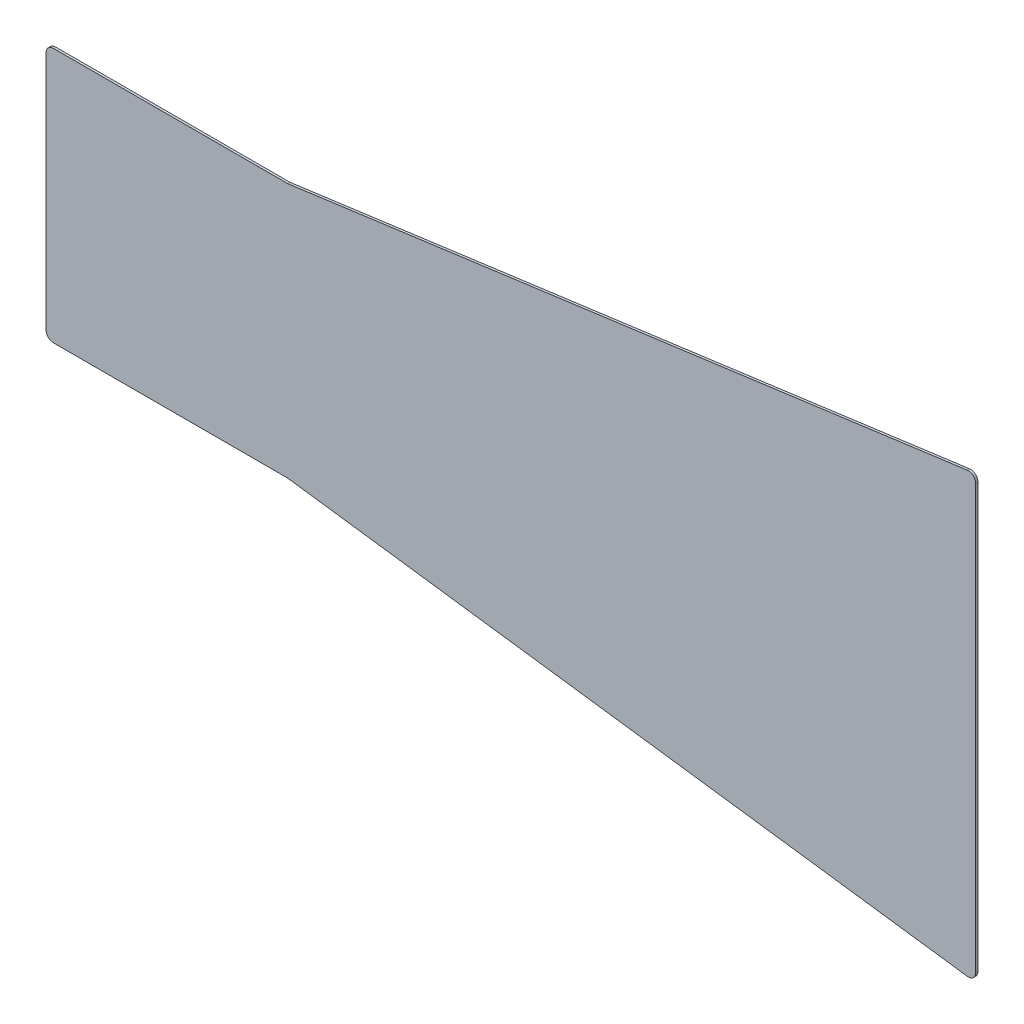
ISO-10303-21;
HEADER;
FILE_DESCRIPTION(('STEP AP214'),'2;1');
FILE_NAME('part.step','',(''),(''),'','','');
FILE_SCHEMA(('AUTOMOTIVE_DESIGN { 1 0 10303 214 1 1 1 1 }'));
ENDSEC;
DATA;
#1=APPLICATION_CONTEXT('core data for automotive mechanical design processes');
#2=APPLICATION_PROTOCOL_DEFINITION('international standard','automotive_design',2000,#1);
#3=PRODUCT_CONTEXT('',#1,'mechanical');
#4=PRODUCT('Part','Part','',(#3));
#5=PRODUCT_RELATED_PRODUCT_CATEGORY('part','',(#4));
#6=PRODUCT_DEFINITION_FORMATION('','',#4);
#7=PRODUCT_DEFINITION_CONTEXT('part definition',#1,'design');
#8=PRODUCT_DEFINITION('design','',#6,#7);
#9=PRODUCT_DEFINITION_SHAPE('','',#8);
#10=(LENGTH_UNIT() NAMED_UNIT(*) SI_UNIT(.MILLI.,.METRE.));
#11=(NAMED_UNIT(*) PLANE_ANGLE_UNIT() SI_UNIT($,.RADIAN.));
#12=(NAMED_UNIT(*) SI_UNIT($,.STERADIAN.) SOLID_ANGLE_UNIT());
#13=UNCERTAINTY_MEASURE_WITH_UNIT(LENGTH_MEASURE(1.E-05),#10,'distance_accuracy_value','');
#14=(GEOMETRIC_REPRESENTATION_CONTEXT(3) GLOBAL_UNCERTAINTY_ASSIGNED_CONTEXT((#13)) GLOBAL_UNIT_ASSIGNED_CONTEXT((#10,
#11,#12)) REPRESENTATION_CONTEXT('',''));
#15=CARTESIAN_POINT('',(0.,0.,0.));
#16=DIRECTION('',(0.,0.,1.));
#17=DIRECTION('',(1.,0.,0.));
#18=AXIS2_PLACEMENT_3D('',#15,#16,#17);
#19=CARTESIAN_POINT('',(-1276.36170533081,175.109237439629,-3.175));
#20=DIRECTION('',(0.,1.,0.));
#21=DIRECTION('',(0.,0.,1.));
#22=AXIS2_PLACEMENT_3D('',#19,#20,#21);
#23=PLANE('',#22);
#24=DIRECTION('',(-1.,0.,0.));
#25=VECTOR('',#24,1.);
#26=CARTESIAN_POINT('',(-1276.36170533081,175.109237439629,-3.175));
#27=LINE('',#26,#25);
#28=CARTESIAN_POINT('',(-944.783937854782,175.109237439629,-3.175));
#29=VERTEX_POINT('',#28);
#30=CARTESIAN_POINT('',(-1266.36170533081,175.109237439629,-3.175));
#31=VERTEX_POINT('',#30);
#32=EDGE_CURVE('E135',#29,#31,#27,.T.);
#33=ORIENTED_EDGE('',*,*,#32,.T.);
#34=DIRECTION('',(0.,0.,1.));
#35=VECTOR('',#34,1.);
#36=CARTESIAN_POINT('',(-1266.36170533081,175.109237439629,-3.175));
#37=LINE('',#36,#35);
#38=CARTESIAN_POINT('',(-1266.36170533081,175.109237439629,0.));
#39=VERTEX_POINT('',#38);
#40=EDGE_CURVE('E204',#31,#39,#37,.T.);
#41=ORIENTED_EDGE('',*,*,#40,.T.);
#42=DIRECTION('',(-1.,0.,0.));
#43=VECTOR('',#42,1.);
#44=CARTESIAN_POINT('',(-1276.36170533081,175.109237439629,0.));
#45=LINE('',#44,#43);
#46=CARTESIAN_POINT('',(-944.783937854782,175.109237439629,0.));
#47=VERTEX_POINT('',#46);
#48=EDGE_CURVE('E138',#47,#39,#45,.T.);
#49=ORIENTED_EDGE('',*,*,#48,.F.);
#50=DIRECTION('',(0.,0.,1.));
#51=VECTOR('',#50,1.);
#52=CARTESIAN_POINT('',(-944.783937854782,175.109237439629,-3.175));
#53=LINE('',#52,#51);
#54=EDGE_CURVE('E124',#29,#47,#53,.T.);
#55=ORIENTED_EDGE('',*,*,#54,.F.);
#56=EDGE_LOOP('',(#33,#41,#49,#55));
#57=FACE_BOUND('',#56,.T.);
#58=ADVANCED_FACE('F36',(#57),#23,.T.);
#59=CARTESIAN_POINT('',(-944.783937854782,175.109237439629,-3.175));
#60=DIRECTION('',(-0.133656993769155,0.991027652498452,0.));
#61=DIRECTION('',(-0.991027652498452,-0.133656993769155,0.));
#62=AXIS2_PLACEMENT_3D('',#59,#60,#61);
#63=PLANE('',#62);
#64=DIRECTION('',(-0.991027652498452,-0.133656993769155,0.));
#65=VECTOR('',#64,1.);
#66=CARTESIAN_POINT('',(-944.783937854782,175.109237439629,0.));
#67=LINE('',#66,#65);
#68=CARTESIAN_POINT('',(-11.3365699376916,301.000547054447,0.));
#69=VERTEX_POINT('',#68);
#70=EDGE_CURVE('E145',#69,#47,#67,.T.);
#71=ORIENTED_EDGE('',*,*,#70,.F.);
#72=DIRECTION('',(0.,0.,1.));
#73=VECTOR('',#72,1.);
#74=CARTESIAN_POINT('',(-11.3365699376915,301.000547054447,-3.175));
#75=LINE('',#74,#73);
#76=CARTESIAN_POINT('',(-11.3365699376916,301.000547054447,-3.175));
#77=VERTEX_POINT('',#76);
#78=EDGE_CURVE('E127',#69,#77,#75,.F.);
#79=ORIENTED_EDGE('',*,*,#78,.T.);
#80=DIRECTION('',(-0.991027652498452,-0.133656993769155,0.));
#81=VECTOR('',#80,1.);
#82=CARTESIAN_POINT('',(-944.783937854782,175.109237439629,-3.175));
#83=LINE('',#82,#81);
#84=EDGE_CURVE('E120',#77,#29,#83,.T.);
#85=ORIENTED_EDGE('',*,*,#84,.T.);
#86=ORIENTED_EDGE('',*,*,#54,.T.);
#87=EDGE_LOOP('',(#71,#79,#85,#86));
#88=FACE_BOUND('',#87,.T.);
#89=ADVANCED_FACE('F123',(#88),#63,.T.);
#90=CARTESIAN_POINT('',(0.,302.529477002774,-3.175));
#91=DIRECTION('',(1.,0.,0.));
#92=DIRECTION('',(0.,0.,-1.));
#93=AXIS2_PLACEMENT_3D('',#90,#91,#92);
#94=PLANE('',#93);
#95=DIRECTION('',(0.,1.,0.));
#96=VECTOR('',#95,1.);
#97=CARTESIAN_POINT('',(0.,302.529477002774,-3.175));
#98=LINE('',#97,#96);
#99=CARTESIAN_POINT('',(0.,-291.090270529462,-3.175));
#100=VERTEX_POINT('',#99);
#101=CARTESIAN_POINT('',(0.,291.090270529462,-3.175));
#102=VERTEX_POINT('',#101);
#103=EDGE_CURVE('E130',#100,#102,#98,.T.);
#104=ORIENTED_EDGE('',*,*,#103,.T.);
#105=DIRECTION('',(0.,0.,1.));
#106=VECTOR('',#105,1.);
#107=CARTESIAN_POINT('',(0.,291.090270529462,-3.175));
#108=LINE('',#107,#106);
#109=CARTESIAN_POINT('',(0.,291.090270529462,0.));
#110=VERTEX_POINT('',#109);
#111=EDGE_CURVE('E172',#102,#110,#108,.T.);
#112=ORIENTED_EDGE('',*,*,#111,.T.);
#113=DIRECTION('',(0.,1.,0.));
#114=VECTOR('',#113,1.);
#115=CARTESIAN_POINT('',(0.,302.529477002774,0.));
#116=LINE('',#115,#114);
#117=CARTESIAN_POINT('',(0.,-291.090270529462,0.));
#118=VERTEX_POINT('',#117);
#119=EDGE_CURVE('E149',#118,#110,#116,.T.);
#120=ORIENTED_EDGE('',*,*,#119,.F.);
#121=DIRECTION('',(0.,0.,1.));
#122=VECTOR('',#121,1.);
#123=CARTESIAN_POINT('',(0.,-291.090270529462,-3.175));
#124=LINE('',#123,#122);
#125=EDGE_CURVE('E139',#118,#100,#124,.F.);
#126=ORIENTED_EDGE('',*,*,#125,.T.);
#127=EDGE_LOOP('',(#104,#112,#120,#126));
#128=FACE_BOUND('',#127,.T.);
#129=ADVANCED_FACE('F235',(#128),#94,.T.);
#130=CARTESIAN_POINT('',(-944.783937854782,-175.109237439629,-3.175));
#131=DIRECTION('',(-0.133656993769155,-0.991027652498452,0.));
#132=DIRECTION('',(0.991027652498452,-0.133656993769155,0.));
#133=AXIS2_PLACEMENT_3D('',#130,#131,#132);
#134=PLANE('',#133);
#135=DIRECTION('',(0.991027652498452,-0.133656993769155,0.));
#136=VECTOR('',#135,1.);
#137=CARTESIAN_POINT('',(-944.783937854782,-175.109237439629,-3.175));
#138=LINE('',#137,#136);
#139=CARTESIAN_POINT('',(-944.118664438771,-175.198960914644,-3.175));
#140=VERTEX_POINT('',#139);
#141=CARTESIAN_POINT('',(-11.3365699376917,-301.000547054447,-3.175));
#142=VERTEX_POINT('',#141);
#143=EDGE_CURVE('E154',#140,#142,#138,.T.);
#144=ORIENTED_EDGE('',*,*,#143,.T.);
#145=DIRECTION('',(0.,0.,1.));
#146=VECTOR('',#145,1.);
#147=CARTESIAN_POINT('',(-11.3365699376916,-301.000547054447,-3.175));
#148=LINE('',#147,#146);
#149=CARTESIAN_POINT('',(-11.3365699376917,-301.000547054447,0.));
#150=VERTEX_POINT('',#149);
#151=EDGE_CURVE('E192',#142,#150,#148,.T.);
#152=ORIENTED_EDGE('',*,*,#151,.T.);
#153=DIRECTION('',(0.991027652498452,-0.133656993769155,0.));
#154=VECTOR('',#153,1.);
#155=CARTESIAN_POINT('',(-944.783937854782,-175.109237439629,0.));
#156=LINE('',#155,#154);
#157=CARTESIAN_POINT('',(-944.118664438771,-175.198960914644,0.));
#158=VERTEX_POINT('',#157);
#159=EDGE_CURVE('E166',#158,#150,#156,.T.);
#160=ORIENTED_EDGE('',*,*,#159,.F.);
#161=DIRECTION('',(0.,0.,1.));
#162=VECTOR('',#161,1.);
#163=CARTESIAN_POINT('',(-944.118664438771,-175.198960914644,-3.175));
#164=LINE('',#163,#162);
#165=EDGE_CURVE('E190',#158,#140,#164,.F.);
#166=ORIENTED_EDGE('',*,*,#165,.T.);
#167=EDGE_LOOP('',(#144,#152,#160,#166));
#168=FACE_BOUND('',#167,.T.);
#169=ADVANCED_FACE('F213',(#168),#134,.T.);
#170=CARTESIAN_POINT('',(-1276.36170533081,-175.109237439629,-3.175));
#171=DIRECTION('',(0.,-1.,0.));
#172=DIRECTION('',(1.,0.,0.));
#173=AXIS2_PLACEMENT_3D('',#170,#171,#172);
#174=PLANE('',#173);
#175=DIRECTION('',(1.,0.,0.));
#176=VECTOR('',#175,1.);
#177=CARTESIAN_POINT('',(-1276.36170533081,-175.109237439629,-3.175));
#178=LINE('',#177,#176);
#179=CARTESIAN_POINT('',(-1266.36170533081,-175.109237439629,-3.175));
#180=VERTEX_POINT('',#179);
#181=CARTESIAN_POINT('',(-945.455234376463,-175.109237439629,-3.175));
#182=VERTEX_POINT('',#181);
#183=EDGE_CURVE('E147',#180,#182,#178,.T.);
#184=ORIENTED_EDGE('',*,*,#183,.T.);
#185=DIRECTION('',(0.,0.,1.));
#186=VECTOR('',#185,1.);
#187=CARTESIAN_POINT('',(-945.455234376463,-175.109237439629,0.));
#188=LINE('',#187,#186);
#189=CARTESIAN_POINT('',(-945.455234376463,-175.109237439629,0.));
#190=VERTEX_POINT('',#189);
#191=EDGE_CURVE('E197',#182,#190,#188,.T.);
#192=ORIENTED_EDGE('',*,*,#191,.T.);
#193=DIRECTION('',(1.,0.,0.));
#194=VECTOR('',#193,1.);
#195=CARTESIAN_POINT('',(-1276.36170533081,-175.109237439629,0.));
#196=LINE('',#195,#194);
#197=CARTESIAN_POINT('',(-1266.36170533081,-175.109237439629,0.));
#198=VERTEX_POINT('',#197);
#199=EDGE_CURVE('E163',#198,#190,#196,.T.);
#200=ORIENTED_EDGE('',*,*,#199,.F.);
#201=DIRECTION('',(0.,0.,1.));
#202=VECTOR('',#201,1.);
#203=CARTESIAN_POINT('',(-1266.36170533081,-175.109237439629,-3.175));
#204=LINE('',#203,#202);
#205=EDGE_CURVE('E195',#198,#180,#204,.F.);
#206=ORIENTED_EDGE('',*,*,#205,.T.);
#207=EDGE_LOOP('',(#184,#192,#200,#206));
#208=FACE_BOUND('',#207,.T.);
#209=ADVANCED_FACE('F219',(#208),#174,.T.);
#210=CARTESIAN_POINT('',(-1276.36170533081,-175.109237439629,-3.175));
#211=DIRECTION('',(-1.,0.,0.));
#212=DIRECTION('',(0.,0.,1.));
#213=AXIS2_PLACEMENT_3D('',#210,#211,#212);
#214=PLANE('',#213);
#215=DIRECTION('',(0.,-1.,0.));
#216=VECTOR('',#215,1.);
#217=CARTESIAN_POINT('',(-1276.36170533081,-175.109237439629,-3.175));
#218=LINE('',#217,#216);
#219=CARTESIAN_POINT('',(-1276.36170533081,165.109237439629,-3.175));
#220=VERTEX_POINT('',#219);
#221=CARTESIAN_POINT('',(-1276.36170533081,-165.109237439629,-3.175));
#222=VERTEX_POINT('',#221);
#223=EDGE_CURVE('E144',#220,#222,#218,.T.);
#224=ORIENTED_EDGE('',*,*,#223,.T.);
#225=DIRECTION('',(0.,0.,1.));
#226=VECTOR('',#225,1.);
#227=CARTESIAN_POINT('',(-1276.36170533081,-165.109237439629,-3.175));
#228=LINE('',#227,#226);
#229=CARTESIAN_POINT('',(-1276.36170533081,-165.109237439629,0.));
#230=VERTEX_POINT('',#229);
#231=EDGE_CURVE('E201',#222,#230,#228,.T.);
#232=ORIENTED_EDGE('',*,*,#231,.T.);
#233=DIRECTION('',(0.,-1.,0.));
#234=VECTOR('',#233,1.);
#235=CARTESIAN_POINT('',(-1276.36170533081,-175.109237439629,0.));
#236=LINE('',#235,#234);
#237=CARTESIAN_POINT('',(-1276.36170533081,165.109237439629,0.));
#238=VERTEX_POINT('',#237);
#239=EDGE_CURVE('E160',#238,#230,#236,.T.);
#240=ORIENTED_EDGE('',*,*,#239,.F.);
#241=DIRECTION('',(0.,0.,1.));
#242=VECTOR('',#241,1.);
#243=CARTESIAN_POINT('',(-1276.36170533081,165.109237439629,-3.175));
#244=LINE('',#243,#242);
#245=EDGE_CURVE('E58',#238,#220,#244,.F.);
#246=ORIENTED_EDGE('',*,*,#245,.T.);
#247=EDGE_LOOP('',(#224,#232,#240,#246));
#248=FACE_BOUND('',#247,.T.);
#249=ADVANCED_FACE('F224',(#248),#214,.T.);
#250=CARTESIAN_POINT('',(0.,0.,-3.175));
#251=DIRECTION('',(0.,0.,-1.));
#252=DIRECTION('',(-1.,0.,0.));
#253=AXIS2_PLACEMENT_3D('',#250,#251,#252);
#254=PLANE('',#253);
#255=ORIENTED_EDGE('',*,*,#84,.F.);
#256=CARTESIAN_POINT('',(-10.,291.090270529462,-3.175));
#257=DIRECTION('',(0.,0.,-1.));
#258=DIRECTION('',(-1.,0.,0.));
#259=AXIS2_PLACEMENT_3D('',#256,#257,#258);
#260=CIRCLE('',#259,10.);
#261=EDGE_CURVE('E188',#77,#102,#260,.T.);
#262=ORIENTED_EDGE('',*,*,#261,.T.);
#263=ORIENTED_EDGE('',*,*,#103,.F.);
#264=CARTESIAN_POINT('',(-10.,-291.090270529462,-3.175));
#265=DIRECTION('',(0.,0.,-1.));
#266=DIRECTION('',(-1.,0.,0.));
#267=AXIS2_PLACEMENT_3D('',#264,#265,#266);
#268=CIRCLE('',#267,10.);
#269=EDGE_CURVE('E186',#100,#142,#268,.T.);
#270=ORIENTED_EDGE('',*,*,#269,.T.);
#271=ORIENTED_EDGE('',*,*,#143,.F.);
#272=CARTESIAN_POINT('',(-945.455234376463,-185.109237439629,-3.175));
#273=DIRECTION('',(0.,0.,-1.));
#274=DIRECTION('',(-1.,0.,0.));
#275=AXIS2_PLACEMENT_3D('',#272,#273,#274);
#276=CIRCLE('',#275,10.);
#277=EDGE_CURVE('E11',#140,#182,#276,.F.);
#278=ORIENTED_EDGE('',*,*,#277,.T.);
#279=ORIENTED_EDGE('',*,*,#183,.F.);
#280=CARTESIAN_POINT('',(-1266.36170533081,-165.109237439629,-3.175));
#281=DIRECTION('',(0.,0.,-1.));
#282=DIRECTION('',(-1.,0.,0.));
#283=AXIS2_PLACEMENT_3D('',#280,#281,#282);
#284=CIRCLE('',#283,10.);
#285=EDGE_CURVE('E51',#180,#222,#284,.T.);
#286=ORIENTED_EDGE('',*,*,#285,.T.);
#287=ORIENTED_EDGE('',*,*,#223,.F.);
#288=CARTESIAN_POINT('',(-1266.36170533081,165.109237439629,-3.175));
#289=DIRECTION('',(0.,0.,-1.));
#290=DIRECTION('',(-1.,0.,0.));
#291=AXIS2_PLACEMENT_3D('',#288,#289,#290);
#292=CIRCLE('',#291,10.);
#293=EDGE_CURVE('E143',#220,#31,#292,.T.);
#294=ORIENTED_EDGE('',*,*,#293,.T.);
#295=ORIENTED_EDGE('',*,*,#32,.F.);
#296=EDGE_LOOP('',(#255,#262,#263,#270,#271,#278,#279,#286,#287,#294,#295));
#297=FACE_BOUND('',#296,.T.);
#298=ADVANCED_FACE('F141',(#297),#254,.T.);
#299=CARTESIAN_POINT('',(0.,0.,0.));
#300=DIRECTION('',(0.,0.,-1.));
#301=DIRECTION('',(-1.,0.,0.));
#302=AXIS2_PLACEMENT_3D('',#299,#300,#301);
#303=PLANE('',#302);
#304=ORIENTED_EDGE('',*,*,#119,.T.);
#305=CARTESIAN_POINT('',(-10.,291.090270529462,0.));
#306=DIRECTION('',(0.,0.,-1.));
#307=DIRECTION('',(-1.,0.,0.));
#308=AXIS2_PLACEMENT_3D('',#305,#306,#307);
#309=CIRCLE('',#308,10.);
#310=EDGE_CURVE('E181',#110,#69,#309,.F.);
#311=ORIENTED_EDGE('',*,*,#310,.T.);
#312=ORIENTED_EDGE('',*,*,#70,.T.);
#313=ORIENTED_EDGE('',*,*,#48,.T.);
#314=CARTESIAN_POINT('',(-1266.36170533081,165.109237439629,0.));
#315=DIRECTION('',(0.,0.,-1.));
#316=DIRECTION('',(-1.,0.,0.));
#317=AXIS2_PLACEMENT_3D('',#314,#315,#316);
#318=CIRCLE('',#317,10.);
#319=EDGE_CURVE('E175',#39,#238,#318,.F.);
#320=ORIENTED_EDGE('',*,*,#319,.T.);
#321=ORIENTED_EDGE('',*,*,#239,.T.);
#322=CARTESIAN_POINT('',(-1266.36170533081,-165.109237439629,0.));
#323=DIRECTION('',(0.,0.,-1.));
#324=DIRECTION('',(-1.,0.,0.));
#325=AXIS2_PLACEMENT_3D('',#322,#323,#324);
#326=CIRCLE('',#325,10.);
#327=EDGE_CURVE('E177',#230,#198,#326,.F.);
#328=ORIENTED_EDGE('',*,*,#327,.T.);
#329=ORIENTED_EDGE('',*,*,#199,.T.);
#330=CARTESIAN_POINT('',(-945.455234376463,-185.109237439629,0.));
#331=DIRECTION('',(0.,0.,-1.));
#332=DIRECTION('',(-1.,0.,0.));
#333=AXIS2_PLACEMENT_3D('',#330,#331,#332);
#334=CIRCLE('',#333,10.);
#335=EDGE_CURVE('E44',#190,#158,#334,.T.);
#336=ORIENTED_EDGE('',*,*,#335,.T.);
#337=ORIENTED_EDGE('',*,*,#159,.T.);
#338=CARTESIAN_POINT('',(-10.,-291.090270529462,0.));
#339=DIRECTION('',(0.,0.,-1.));
#340=DIRECTION('',(-1.,0.,0.));
#341=AXIS2_PLACEMENT_3D('',#338,#339,#340);
#342=CIRCLE('',#341,10.);
#343=EDGE_CURVE('E179',#150,#118,#342,.F.);
#344=ORIENTED_EDGE('',*,*,#343,.T.);
#345=EDGE_LOOP('',(#304,#311,#312,#313,#320,#321,#328,#329,#336,#337,#344));
#346=FACE_BOUND('',#345,.T.);
#347=ADVANCED_FACE('F207',(#346),#303,.F.);
#348=CARTESIAN_POINT('',(-10.,291.090270529462,-3.175));
#349=DIRECTION('',(0.,0.,1.));
#350=DIRECTION('',(1.,0.,0.));
#351=AXIS2_PLACEMENT_3D('',#348,#349,#350);
#352=CYLINDRICAL_SURFACE('',#351,10.);
#353=ORIENTED_EDGE('',*,*,#261,.F.);
#354=ORIENTED_EDGE('',*,*,#78,.F.);
#355=ORIENTED_EDGE('',*,*,#310,.F.);
#356=ORIENTED_EDGE('',*,*,#111,.F.);
#357=EDGE_LOOP('',(#353,#354,#355,#356));
#358=FACE_BOUND('',#357,.T.);
#359=ADVANCED_FACE('F240',(#358),#352,.T.);
#360=CARTESIAN_POINT('',(-10.,-291.090270529462,-3.175));
#361=DIRECTION('',(0.,0.,1.));
#362=DIRECTION('',(1.,0.,0.));
#363=AXIS2_PLACEMENT_3D('',#360,#361,#362);
#364=CYLINDRICAL_SURFACE('',#363,10.);
#365=ORIENTED_EDGE('',*,*,#269,.F.);
#366=ORIENTED_EDGE('',*,*,#125,.F.);
#367=ORIENTED_EDGE('',*,*,#343,.F.);
#368=ORIENTED_EDGE('',*,*,#151,.F.);
#369=EDGE_LOOP('',(#365,#366,#367,#368));
#370=FACE_BOUND('',#369,.T.);
#371=ADVANCED_FACE('F243',(#370),#364,.T.);
#372=CARTESIAN_POINT('',(-945.455234376463,-185.109237439629,-3.175));
#373=DIRECTION('',(0.,0.,-1.));
#374=DIRECTION('',(-1.,0.,0.));
#375=AXIS2_PLACEMENT_3D('',#372,#373,#374);
#376=CYLINDRICAL_SURFACE('',#375,10.);
#377=ORIENTED_EDGE('',*,*,#277,.F.);
#378=ORIENTED_EDGE('',*,*,#165,.F.);
#379=ORIENTED_EDGE('',*,*,#335,.F.);
#380=ORIENTED_EDGE('',*,*,#191,.F.);
#381=EDGE_LOOP('',(#377,#378,#379,#380));
#382=FACE_BOUND('',#381,.T.);
#383=ADVANCED_FACE('F217',(#382),#376,.F.);
#384=CARTESIAN_POINT('',(-1266.36170533081,-165.109237439629,-3.175));
#385=DIRECTION('',(0.,0.,1.));
#386=DIRECTION('',(1.,0.,0.));
#387=AXIS2_PLACEMENT_3D('',#384,#385,#386);
#388=CYLINDRICAL_SURFACE('',#387,10.);
#389=ORIENTED_EDGE('',*,*,#285,.F.);
#390=ORIENTED_EDGE('',*,*,#205,.F.);
#391=ORIENTED_EDGE('',*,*,#327,.F.);
#392=ORIENTED_EDGE('',*,*,#231,.F.);
#393=EDGE_LOOP('',(#389,#390,#391,#392));
#394=FACE_BOUND('',#393,.T.);
#395=ADVANCED_FACE('F222',(#394),#388,.T.);
#396=CARTESIAN_POINT('',(-1266.36170533081,165.109237439629,-3.175));
#397=DIRECTION('',(0.,0.,1.));
#398=DIRECTION('',(1.,0.,0.));
#399=AXIS2_PLACEMENT_3D('',#396,#397,#398);
#400=CYLINDRICAL_SURFACE('',#399,10.);
#401=ORIENTED_EDGE('',*,*,#293,.F.);
#402=ORIENTED_EDGE('',*,*,#245,.F.);
#403=ORIENTED_EDGE('',*,*,#319,.F.);
#404=ORIENTED_EDGE('',*,*,#40,.F.);
#405=EDGE_LOOP('',(#401,#402,#403,#404));
#406=FACE_BOUND('',#405,.T.);
#407=ADVANCED_FACE('F38',(#406),#400,.T.);
#408=CLOSED_SHELL('',(#58,#89,#129,#169,#209,#249,#298,#347,#359,#371,#383,#395,#407));
#409=MANIFOLD_SOLID_BREP('B2',#408);
#410=ADVANCED_BREP_SHAPE_REPRESENTATION('',(#18,#409),#14);
#411=SHAPE_DEFINITION_REPRESENTATION(#9,#410);
ENDSEC;
END-ISO-10303-21;
